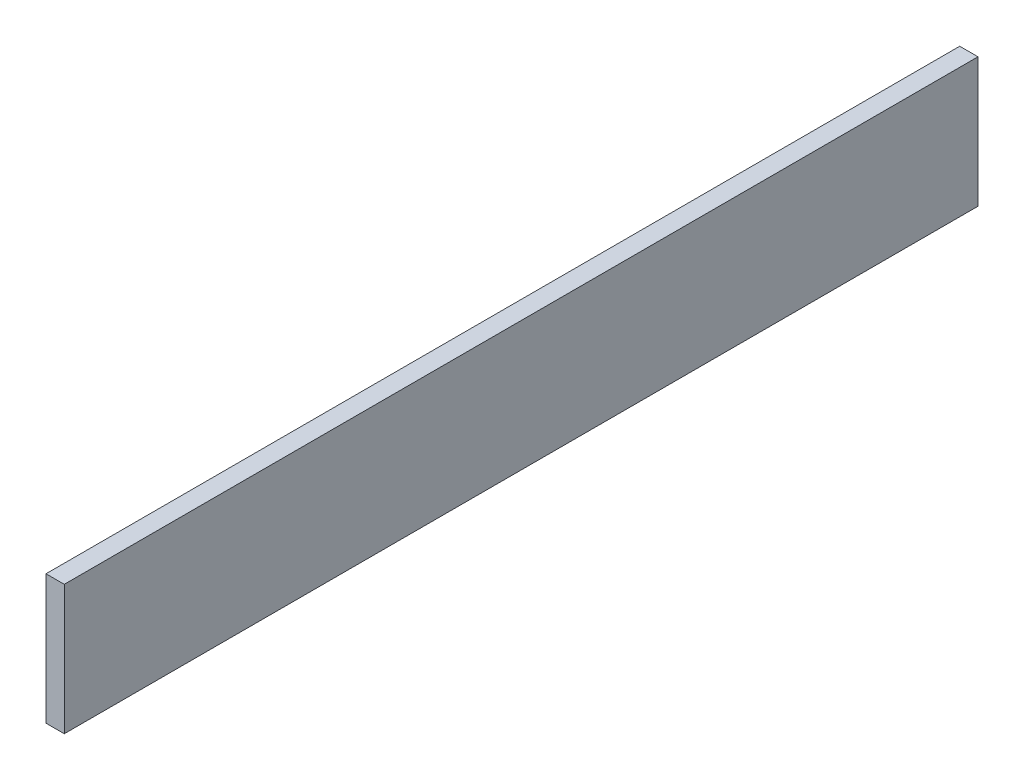
ISO-10303-21;
HEADER;
FILE_DESCRIPTION(('STEP AP214'),'2;1');
FILE_NAME('part.step','',(''),(''),'','','');
FILE_SCHEMA(('AUTOMOTIVE_DESIGN { 1 0 10303 214 1 1 1 1 }'));
ENDSEC;
DATA;
#1=APPLICATION_CONTEXT('core data for automotive mechanical design processes');
#2=APPLICATION_PROTOCOL_DEFINITION('international standard','automotive_design',2000,#1);
#3=PRODUCT_CONTEXT('',#1,'mechanical');
#4=PRODUCT('Part','Part','',(#3));
#5=PRODUCT_RELATED_PRODUCT_CATEGORY('part','',(#4));
#6=PRODUCT_DEFINITION_FORMATION('','',#4);
#7=PRODUCT_DEFINITION_CONTEXT('part definition',#1,'design');
#8=PRODUCT_DEFINITION('design','',#6,#7);
#9=PRODUCT_DEFINITION_SHAPE('','',#8);
#10=(LENGTH_UNIT() NAMED_UNIT(*) SI_UNIT(.MILLI.,.METRE.));
#11=(NAMED_UNIT(*) PLANE_ANGLE_UNIT() SI_UNIT($,.RADIAN.));
#12=(NAMED_UNIT(*) SI_UNIT($,.STERADIAN.) SOLID_ANGLE_UNIT());
#13=UNCERTAINTY_MEASURE_WITH_UNIT(LENGTH_MEASURE(1.E-05),#10,'distance_accuracy_value','');
#14=(GEOMETRIC_REPRESENTATION_CONTEXT(3) GLOBAL_UNCERTAINTY_ASSIGNED_CONTEXT((#13)) GLOBAL_UNIT_ASSIGNED_CONTEXT((#10,
#11,#12)) REPRESENTATION_CONTEXT('',''));
#15=CARTESIAN_POINT('',(0.,0.,0.));
#16=DIRECTION('',(0.,0.,1.));
#17=DIRECTION('',(1.,0.,0.));
#18=AXIS2_PLACEMENT_3D('',#15,#16,#17);
#19=CARTESIAN_POINT('',(6.,21.25,150.));
#20=DIRECTION('',(0.,0.,-1.));
#21=DIRECTION('',(-1.,0.,0.));
#22=AXIS2_PLACEMENT_3D('',#19,#20,#21);
#23=PLANE('',#22);
#24=DIRECTION('',(0.,-1.,0.));
#25=VECTOR('',#24,1.);
#26=CARTESIAN_POINT('',(0.,21.25,150.));
#27=LINE('',#26,#25);
#28=CARTESIAN_POINT('',(0.,21.25,150.));
#29=VERTEX_POINT('',#28);
#30=CARTESIAN_POINT('',(0.,-21.25,150.));
#31=VERTEX_POINT('',#30);
#32=EDGE_CURVE('E95',#29,#31,#27,.T.);
#33=ORIENTED_EDGE('',*,*,#32,.T.);
#34=DIRECTION('',(-1.,0.,0.));
#35=VECTOR('',#34,1.);
#36=CARTESIAN_POINT('',(6.,-21.25,150.));
#37=LINE('',#36,#35);
#38=CARTESIAN_POINT('',(6.,-21.25,150.));
#39=VERTEX_POINT('',#38);
#40=EDGE_CURVE('E11',#39,#31,#37,.T.);
#41=ORIENTED_EDGE('',*,*,#40,.F.);
#42=DIRECTION('',(0.,-1.,0.));
#43=VECTOR('',#42,1.);
#44=CARTESIAN_POINT('',(6.,21.25,150.));
#45=LINE('',#44,#43);
#46=CARTESIAN_POINT('',(6.,21.25,150.));
#47=VERTEX_POINT('',#46);
#48=EDGE_CURVE('E83',#47,#39,#45,.T.);
#49=ORIENTED_EDGE('',*,*,#48,.F.);
#50=DIRECTION('',(-1.,0.,0.));
#51=VECTOR('',#50,1.);
#52=CARTESIAN_POINT('',(6.,21.25,150.));
#53=LINE('',#52,#51);
#54=EDGE_CURVE('E91',#47,#29,#53,.T.);
#55=ORIENTED_EDGE('',*,*,#54,.T.);
#56=EDGE_LOOP('',(#33,#41,#49,#55));
#57=FACE_BOUND('',#56,.T.);
#58=ADVANCED_FACE('F32',(#57),#23,.F.);
#59=CARTESIAN_POINT('',(6.,-21.25,150.));
#60=DIRECTION('',(0.,1.,0.));
#61=DIRECTION('',(0.,0.,1.));
#62=AXIS2_PLACEMENT_3D('',#59,#60,#61);
#63=PLANE('',#62);
#64=DIRECTION('',(0.,0.,-1.));
#65=VECTOR('',#64,1.);
#66=CARTESIAN_POINT('',(0.,-21.25,150.));
#67=LINE('',#66,#65);
#68=CARTESIAN_POINT('',(0.,-21.25,-150.));
#69=VERTEX_POINT('',#68);
#70=EDGE_CURVE('E87',#31,#69,#67,.T.);
#71=ORIENTED_EDGE('',*,*,#70,.T.);
#72=DIRECTION('',(-1.,0.,0.));
#73=VECTOR('',#72,1.);
#74=CARTESIAN_POINT('',(6.,-21.25,-150.));
#75=LINE('',#74,#73);
#76=CARTESIAN_POINT('',(6.,-21.25,-150.));
#77=VERTEX_POINT('',#76);
#78=EDGE_CURVE('E40',#77,#69,#75,.T.);
#79=ORIENTED_EDGE('',*,*,#78,.F.);
#80=DIRECTION('',(0.,0.,-1.));
#81=VECTOR('',#80,1.);
#82=CARTESIAN_POINT('',(6.,-21.25,150.));
#83=LINE('',#82,#81);
#84=EDGE_CURVE('E78',#39,#77,#83,.T.);
#85=ORIENTED_EDGE('',*,*,#84,.F.);
#86=ORIENTED_EDGE('',*,*,#40,.T.);
#87=EDGE_LOOP('',(#71,#79,#85,#86));
#88=FACE_BOUND('',#87,.T.);
#89=ADVANCED_FACE('F86',(#88),#63,.F.);
#90=CARTESIAN_POINT('',(6.,21.25,-150.));
#91=DIRECTION('',(0.,0.,1.));
#92=DIRECTION('',(1.,0.,0.));
#93=AXIS2_PLACEMENT_3D('',#90,#91,#92);
#94=PLANE('',#93);
#95=DIRECTION('',(0.,1.,0.));
#96=VECTOR('',#95,1.);
#97=CARTESIAN_POINT('',(0.,21.25,-150.));
#98=LINE('',#97,#96);
#99=CARTESIAN_POINT('',(0.,21.25,-150.));
#100=VERTEX_POINT('',#99);
#101=EDGE_CURVE('E65',#69,#100,#98,.T.);
#102=ORIENTED_EDGE('',*,*,#101,.T.);
#103=DIRECTION('',(-1.,0.,0.));
#104=VECTOR('',#103,1.);
#105=CARTESIAN_POINT('',(6.,21.25,-150.));
#106=LINE('',#105,#104);
#107=CARTESIAN_POINT('',(6.,21.25,-150.));
#108=VERTEX_POINT('',#107);
#109=EDGE_CURVE('E88',#108,#100,#106,.T.);
#110=ORIENTED_EDGE('',*,*,#109,.F.);
#111=DIRECTION('',(0.,1.,0.));
#112=VECTOR('',#111,1.);
#113=CARTESIAN_POINT('',(6.,21.25,-150.));
#114=LINE('',#113,#112);
#115=EDGE_CURVE('E81',#77,#108,#114,.T.);
#116=ORIENTED_EDGE('',*,*,#115,.F.);
#117=ORIENTED_EDGE('',*,*,#78,.T.);
#118=EDGE_LOOP('',(#102,#110,#116,#117));
#119=FACE_BOUND('',#118,.T.);
#120=ADVANCED_FACE('F89',(#119),#94,.F.);
#121=CARTESIAN_POINT('',(6.,21.25,150.));
#122=DIRECTION('',(0.,-1.,0.));
#123=DIRECTION('',(0.,0.,-1.));
#124=AXIS2_PLACEMENT_3D('',#121,#122,#123);
#125=PLANE('',#124);
#126=DIRECTION('',(0.,0.,1.));
#127=VECTOR('',#126,1.);
#128=CARTESIAN_POINT('',(0.,21.25,150.));
#129=LINE('',#128,#127);
#130=EDGE_CURVE('E71',#100,#29,#129,.T.);
#131=ORIENTED_EDGE('',*,*,#130,.T.);
#132=ORIENTED_EDGE('',*,*,#54,.F.);
#133=DIRECTION('',(0.,0.,1.));
#134=VECTOR('',#133,1.);
#135=CARTESIAN_POINT('',(6.,21.25,150.));
#136=LINE('',#135,#134);
#137=EDGE_CURVE('E48',#108,#47,#136,.T.);
#138=ORIENTED_EDGE('',*,*,#137,.F.);
#139=ORIENTED_EDGE('',*,*,#109,.T.);
#140=EDGE_LOOP('',(#131,#132,#138,#139));
#141=FACE_BOUND('',#140,.T.);
#142=ADVANCED_FACE('F102',(#141),#125,.F.);
#143=CARTESIAN_POINT('',(6.,0.,0.));
#144=DIRECTION('',(1.,0.,0.));
#145=DIRECTION('',(0.,0.,-1.));
#146=AXIS2_PLACEMENT_3D('',#143,#144,#145);
#147=PLANE('',#146);
#148=ORIENTED_EDGE('',*,*,#48,.T.);
#149=ORIENTED_EDGE('',*,*,#84,.T.);
#150=ORIENTED_EDGE('',*,*,#115,.T.);
#151=ORIENTED_EDGE('',*,*,#137,.T.);
#152=EDGE_LOOP('',(#148,#149,#150,#151));
#153=FACE_BOUND('',#152,.T.);
#154=ADVANCED_FACE('F79',(#153),#147,.T.);
#155=CARTESIAN_POINT('',(0.,0.,0.));
#156=DIRECTION('',(1.,0.,0.));
#157=DIRECTION('',(0.,0.,-1.));
#158=AXIS2_PLACEMENT_3D('',#155,#156,#157);
#159=PLANE('',#158);
#160=ORIENTED_EDGE('',*,*,#32,.F.);
#161=ORIENTED_EDGE('',*,*,#130,.F.);
#162=ORIENTED_EDGE('',*,*,#101,.F.);
#163=ORIENTED_EDGE('',*,*,#70,.F.);
#164=EDGE_LOOP('',(#160,#161,#162,#163));
#165=FACE_BOUND('',#164,.T.);
#166=ADVANCED_FACE('F105',(#165),#159,.F.);
#167=CLOSED_SHELL('',(#58,#89,#120,#142,#154,#166));
#168=MANIFOLD_SOLID_BREP('B2',#167);
#169=ADVANCED_BREP_SHAPE_REPRESENTATION('',(#18,#168),#14);
#170=SHAPE_DEFINITION_REPRESENTATION(#9,#169);
ENDSEC;
END-ISO-10303-21;
